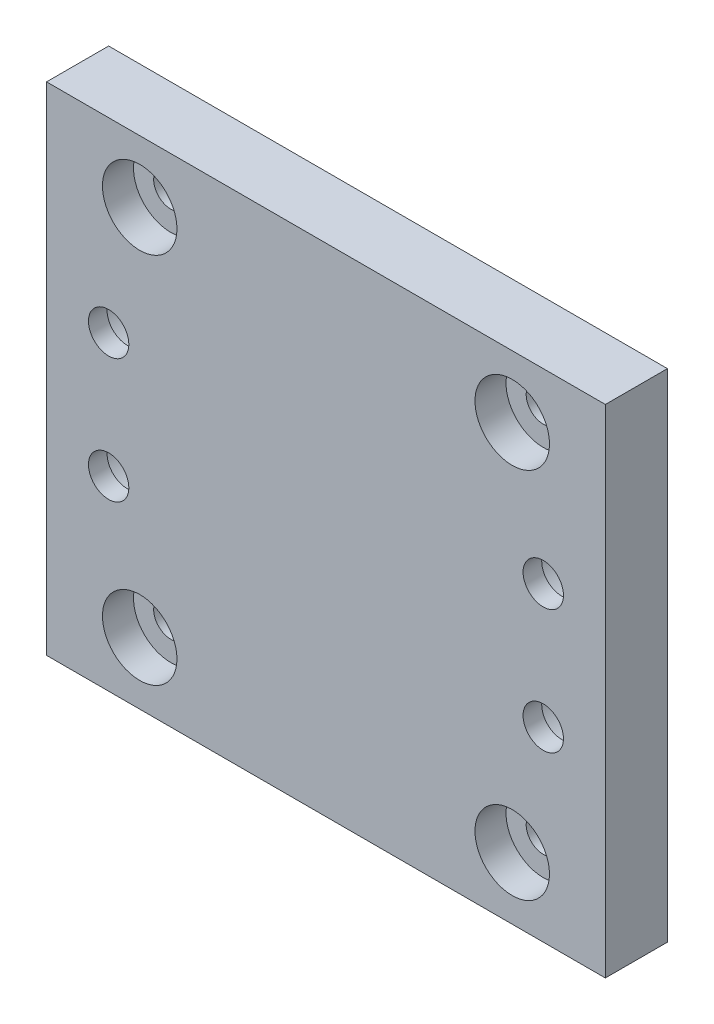
ISO-10303-21;
HEADER;
FILE_DESCRIPTION(('STEP AP214'),'2;1');
FILE_NAME('part.step','',(''),(''),'','','');
FILE_SCHEMA(('AUTOMOTIVE_DESIGN { 1 0 10303 214 1 1 1 1 }'));
ENDSEC;
DATA;
#1=APPLICATION_CONTEXT('core data for automotive mechanical design processes');
#2=APPLICATION_PROTOCOL_DEFINITION('international standard','automotive_design',2000,#1);
#3=PRODUCT_CONTEXT('',#1,'mechanical');
#4=PRODUCT('Part','Part','',(#3));
#5=PRODUCT_RELATED_PRODUCT_CATEGORY('part','',(#4));
#6=PRODUCT_DEFINITION_FORMATION('','',#4);
#7=PRODUCT_DEFINITION_CONTEXT('part definition',#1,'design');
#8=PRODUCT_DEFINITION('design','',#6,#7);
#9=PRODUCT_DEFINITION_SHAPE('','',#8);
#10=(LENGTH_UNIT() NAMED_UNIT(*) SI_UNIT(.MILLI.,.METRE.));
#11=(NAMED_UNIT(*) PLANE_ANGLE_UNIT() SI_UNIT($,.RADIAN.));
#12=(NAMED_UNIT(*) SI_UNIT($,.STERADIAN.) SOLID_ANGLE_UNIT());
#13=UNCERTAINTY_MEASURE_WITH_UNIT(LENGTH_MEASURE(1.E-05),#10,'distance_accuracy_value','');
#14=(GEOMETRIC_REPRESENTATION_CONTEXT(3) GLOBAL_UNCERTAINTY_ASSIGNED_CONTEXT((#13)) GLOBAL_UNIT_ASSIGNED_CONTEXT((#10,
#11,#12)) REPRESENTATION_CONTEXT('',''));
#15=CARTESIAN_POINT('',(0.,0.,0.));
#16=DIRECTION('',(0.,0.,1.));
#17=DIRECTION('',(1.,0.,0.));
#18=AXIS2_PLACEMENT_3D('',#15,#16,#17);
#19=CARTESIAN_POINT('',(-37.4327992920553,16.7884039944123,10.));
#20=DIRECTION('',(0.,0.,-1.));
#21=DIRECTION('',(-1.,0.,0.));
#22=AXIS2_PLACEMENT_3D('',#19,#20,#21);
#23=CYLINDRICAL_SURFACE('',#22,3.25);
#24=CARTESIAN_POINT('',(-37.4327992920553,16.7884039944123,10.));
#25=DIRECTION('',(0.,0.,1.));
#26=DIRECTION('',(1.,0.,0.));
#27=AXIS2_PLACEMENT_3D('',#24,#25,#26);
#28=CIRCLE('',#27,3.25);
#29=CARTESIAN_POINT('',(-34.1827992920553,16.7884039944123,10.));
#30=VERTEX_POINT('',#29);
#31=EDGE_CURVE('E196',#30,#30,#28,.T.);
#32=ORIENTED_EDGE('',*,*,#31,.T.);
#33=EDGE_LOOP('',(#32));
#34=FACE_BOUND('',#33,.T.);
#35=CARTESIAN_POINT('',(-37.4327992920553,16.7884039944123,7.));
#36=DIRECTION('',(0.,0.,-1.));
#37=DIRECTION('',(-1.,0.,0.));
#38=AXIS2_PLACEMENT_3D('',#35,#36,#37);
#39=CIRCLE('',#38,3.25);
#40=CARTESIAN_POINT('',(-40.6827992920553,16.7884039944123,7.));
#41=VERTEX_POINT('',#40);
#42=EDGE_CURVE('E45',#41,#41,#39,.T.);
#43=ORIENTED_EDGE('',*,*,#42,.T.);
#44=EDGE_LOOP('',(#43));
#45=FACE_BOUND('',#44,.T.);
#46=ADVANCED_FACE('F41',(#34,#45),#23,.F.);
#47=CARTESIAN_POINT('',(-37.4327992920553,-3.2115960055877,10.));
#48=DIRECTION('',(0.,0.,-1.));
#49=DIRECTION('',(-1.,0.,0.));
#50=AXIS2_PLACEMENT_3D('',#47,#48,#49);
#51=CYLINDRICAL_SURFACE('',#50,3.25);
#52=CARTESIAN_POINT('',(-37.4327992920553,-3.2115960055877,10.));
#53=DIRECTION('',(0.,0.,1.));
#54=DIRECTION('',(1.,0.,0.));
#55=AXIS2_PLACEMENT_3D('',#52,#53,#54);
#56=CIRCLE('',#55,3.25);
#57=CARTESIAN_POINT('',(-34.1827992920553,-3.2115960055877,10.));
#58=VERTEX_POINT('',#57);
#59=EDGE_CURVE('E192',#58,#58,#56,.T.);
#60=ORIENTED_EDGE('',*,*,#59,.T.);
#61=EDGE_LOOP('',(#60));
#62=FACE_BOUND('',#61,.T.);
#63=CARTESIAN_POINT('',(-37.4327992920553,-3.2115960055877,7.));
#64=DIRECTION('',(0.,0.,-1.));
#65=DIRECTION('',(-1.,0.,0.));
#66=AXIS2_PLACEMENT_3D('',#63,#64,#65);
#67=CIRCLE('',#66,3.25);
#68=CARTESIAN_POINT('',(-40.6827992920553,-3.2115960055877,7.));
#69=VERTEX_POINT('',#68);
#70=EDGE_CURVE('E155',#69,#69,#67,.T.);
#71=ORIENTED_EDGE('',*,*,#70,.T.);
#72=EDGE_LOOP('',(#71));
#73=FACE_BOUND('',#72,.T.);
#74=ADVANCED_FACE('F313',(#62,#73),#51,.F.);
#75=CARTESIAN_POINT('',(32.5672007079447,16.7884039944123,10.));
#76=DIRECTION('',(0.,0.,-1.));
#77=DIRECTION('',(-1.,0.,0.));
#78=AXIS2_PLACEMENT_3D('',#75,#76,#77);
#79=CYLINDRICAL_SURFACE('',#78,3.25);
#80=CARTESIAN_POINT('',(32.5672007079447,16.7884039944123,10.));
#81=DIRECTION('',(0.,0.,1.));
#82=DIRECTION('',(1.,0.,0.));
#83=AXIS2_PLACEMENT_3D('',#80,#81,#82);
#84=CIRCLE('',#83,3.25);
#85=CARTESIAN_POINT('',(35.8172007079447,16.7884039944123,10.));
#86=VERTEX_POINT('',#85);
#87=EDGE_CURVE('E188',#86,#86,#84,.T.);
#88=ORIENTED_EDGE('',*,*,#87,.T.);
#89=EDGE_LOOP('',(#88));
#90=FACE_BOUND('',#89,.T.);
#91=CARTESIAN_POINT('',(32.5672007079447,16.7884039944123,7.));
#92=DIRECTION('',(0.,0.,-1.));
#93=DIRECTION('',(-1.,0.,0.));
#94=AXIS2_PLACEMENT_3D('',#91,#92,#93);
#95=CIRCLE('',#94,3.25);
#96=CARTESIAN_POINT('',(29.3172007079447,16.7884039944123,7.));
#97=VERTEX_POINT('',#96);
#98=EDGE_CURVE('E151',#97,#97,#95,.T.);
#99=ORIENTED_EDGE('',*,*,#98,.T.);
#100=EDGE_LOOP('',(#99));
#101=FACE_BOUND('',#100,.T.);
#102=ADVANCED_FACE('F319',(#90,#101),#79,.F.);
#103=CARTESIAN_POINT('',(32.5672007079447,-3.2115960055877,10.));
#104=DIRECTION('',(0.,0.,-1.));
#105=DIRECTION('',(-1.,0.,0.));
#106=AXIS2_PLACEMENT_3D('',#103,#104,#105);
#107=CYLINDRICAL_SURFACE('',#106,3.25);
#108=CARTESIAN_POINT('',(32.5672007079447,-3.2115960055877,10.));
#109=DIRECTION('',(0.,0.,1.));
#110=DIRECTION('',(1.,0.,0.));
#111=AXIS2_PLACEMENT_3D('',#108,#109,#110);
#112=CIRCLE('',#111,3.25);
#113=CARTESIAN_POINT('',(35.8172007079447,-3.2115960055877,10.));
#114=VERTEX_POINT('',#113);
#115=EDGE_CURVE('E146',#114,#114,#112,.T.);
#116=ORIENTED_EDGE('',*,*,#115,.T.);
#117=EDGE_LOOP('',(#116));
#118=FACE_BOUND('',#117,.T.);
#119=CARTESIAN_POINT('',(32.5672007079447,-3.2115960055877,7.));
#120=DIRECTION('',(0.,0.,-1.));
#121=DIRECTION('',(-1.,0.,0.));
#122=AXIS2_PLACEMENT_3D('',#119,#120,#121);
#123=CIRCLE('',#122,3.25);
#124=CARTESIAN_POINT('',(29.3172007079447,-3.2115960055877,7.));
#125=VERTEX_POINT('',#124);
#126=EDGE_CURVE('E147',#125,#125,#123,.T.);
#127=ORIENTED_EDGE('',*,*,#126,.T.);
#128=EDGE_LOOP('',(#127));
#129=FACE_BOUND('',#128,.T.);
#130=ADVANCED_FACE('F334',(#118,#129),#107,.F.);
#131=CARTESIAN_POINT('',(-32.4327992920553,36.7884039944123,10.));
#132=DIRECTION('',(0.,0.,-1.));
#133=DIRECTION('',(-1.,0.,0.));
#134=AXIS2_PLACEMENT_3D('',#131,#132,#133);
#135=CYLINDRICAL_SURFACE('',#134,2.75);
#136=CARTESIAN_POINT('',(-32.4327992920553,36.7884039944123,0.));
#137=DIRECTION('',(0.,0.,1.));
#138=DIRECTION('',(1.,0.,0.));
#139=AXIS2_PLACEMENT_3D('',#136,#137,#138);
#140=CIRCLE('',#139,2.75);
#141=CARTESIAN_POINT('',(-29.6827992920553,36.7884039944123,0.));
#142=VERTEX_POINT('',#141);
#143=EDGE_CURVE('E118',#142,#142,#140,.T.);
#144=ORIENTED_EDGE('',*,*,#143,.F.);
#145=EDGE_LOOP('',(#144));
#146=FACE_BOUND('',#145,.T.);
#147=CARTESIAN_POINT('',(-32.4327992920553,36.7884039944123,5.));
#148=DIRECTION('',(0.,0.,1.));
#149=DIRECTION('',(1.,0.,0.));
#150=AXIS2_PLACEMENT_3D('',#147,#148,#149);
#151=CIRCLE('',#150,2.75);
#152=CARTESIAN_POINT('',(-29.6827992920553,36.7884039944123,5.));
#153=VERTEX_POINT('',#152);
#154=EDGE_CURVE('E142',#153,#153,#151,.T.);
#155=ORIENTED_EDGE('',*,*,#154,.T.);
#156=EDGE_LOOP('',(#155));
#157=FACE_BOUND('',#156,.T.);
#158=ADVANCED_FACE('F330',(#146,#157),#135,.F.);
#159=CARTESIAN_POINT('',(27.5672007079447,36.7884039944123,10.));
#160=DIRECTION('',(0.,0.,-1.));
#161=DIRECTION('',(-1.,0.,0.));
#162=AXIS2_PLACEMENT_3D('',#159,#160,#161);
#163=CYLINDRICAL_SURFACE('',#162,2.75);
#164=CARTESIAN_POINT('',(27.5672007079447,36.7884039944123,0.));
#165=DIRECTION('',(0.,0.,1.));
#166=DIRECTION('',(1.,0.,0.));
#167=AXIS2_PLACEMENT_3D('',#164,#165,#166);
#168=CIRCLE('',#167,2.75);
#169=CARTESIAN_POINT('',(30.3172007079447,36.7884039944123,0.));
#170=VERTEX_POINT('',#169);
#171=EDGE_CURVE('E208',#170,#170,#168,.T.);
#172=ORIENTED_EDGE('',*,*,#171,.F.);
#173=EDGE_LOOP('',(#172));
#174=FACE_BOUND('',#173,.T.);
#175=CARTESIAN_POINT('',(27.5672007079447,36.7884039944123,5.));
#176=DIRECTION('',(0.,0.,1.));
#177=DIRECTION('',(1.,0.,0.));
#178=AXIS2_PLACEMENT_3D('',#175,#176,#177);
#179=CIRCLE('',#178,2.75);
#180=CARTESIAN_POINT('',(30.3172007079447,36.7884039944123,5.));
#181=VERTEX_POINT('',#180);
#182=EDGE_CURVE('E138',#181,#181,#179,.T.);
#183=ORIENTED_EDGE('',*,*,#182,.T.);
#184=EDGE_LOOP('',(#183));
#185=FACE_BOUND('',#184,.T.);
#186=ADVANCED_FACE('F326',(#174,#185),#163,.F.);
#187=CARTESIAN_POINT('',(27.5672007079447,-23.2115960055877,10.));
#188=DIRECTION('',(0.,0.,-1.));
#189=DIRECTION('',(-1.,0.,0.));
#190=AXIS2_PLACEMENT_3D('',#187,#188,#189);
#191=CYLINDRICAL_SURFACE('',#190,2.75);
#192=CARTESIAN_POINT('',(27.5672007079447,-23.2115960055877,0.));
#193=DIRECTION('',(0.,0.,1.));
#194=DIRECTION('',(1.,0.,0.));
#195=AXIS2_PLACEMENT_3D('',#192,#193,#194);
#196=CIRCLE('',#195,2.75);
#197=CARTESIAN_POINT('',(30.3172007079447,-23.2115960055877,0.));
#198=VERTEX_POINT('',#197);
#199=EDGE_CURVE('E204',#198,#198,#196,.T.);
#200=ORIENTED_EDGE('',*,*,#199,.F.);
#201=EDGE_LOOP('',(#200));
#202=FACE_BOUND('',#201,.T.);
#203=CARTESIAN_POINT('',(27.5672007079447,-23.2115960055877,5.));
#204=DIRECTION('',(0.,0.,1.));
#205=DIRECTION('',(1.,0.,0.));
#206=AXIS2_PLACEMENT_3D('',#203,#204,#205);
#207=CIRCLE('',#206,2.75);
#208=CARTESIAN_POINT('',(30.3172007079447,-23.2115960055877,5.));
#209=VERTEX_POINT('',#208);
#210=EDGE_CURVE('E133',#209,#209,#207,.T.);
#211=ORIENTED_EDGE('',*,*,#210,.T.);
#212=EDGE_LOOP('',(#211));
#213=FACE_BOUND('',#212,.T.);
#214=ADVANCED_FACE('F292',(#202,#213),#191,.F.);
#215=CARTESIAN_POINT('',(-32.4327992920553,-23.2115960055877,10.));
#216=DIRECTION('',(0.,0.,-1.));
#217=DIRECTION('',(-1.,0.,0.));
#218=AXIS2_PLACEMENT_3D('',#215,#216,#217);
#219=CYLINDRICAL_SURFACE('',#218,2.74999999999999);
#220=CARTESIAN_POINT('',(-32.4327992920553,-23.2115960055877,0.));
#221=DIRECTION('',(0.,0.,1.));
#222=DIRECTION('',(1.,0.,0.));
#223=AXIS2_PLACEMENT_3D('',#220,#221,#222);
#224=CIRCLE('',#223,2.74999999999999);
#225=CARTESIAN_POINT('',(-29.6827992920553,-23.2115960055877,0.));
#226=VERTEX_POINT('',#225);
#227=EDGE_CURVE('E200',#226,#226,#224,.T.);
#228=ORIENTED_EDGE('',*,*,#227,.F.);
#229=EDGE_LOOP('',(#228));
#230=FACE_BOUND('',#229,.T.);
#231=CARTESIAN_POINT('',(-32.4327992920553,-23.2115960055877,5.));
#232=DIRECTION('',(0.,0.,1.));
#233=DIRECTION('',(1.,0.,0.));
#234=AXIS2_PLACEMENT_3D('',#231,#232,#233);
#235=CIRCLE('',#234,2.74999999999999);
#236=CARTESIAN_POINT('',(-29.6827992920553,-23.2115960055877,5.));
#237=VERTEX_POINT('',#236);
#238=EDGE_CURVE('E129',#237,#237,#235,.T.);
#239=ORIENTED_EDGE('',*,*,#238,.T.);
#240=EDGE_LOOP('',(#239));
#241=FACE_BOUND('',#240,.T.);
#242=ADVANCED_FACE('F289',(#230,#241),#219,.F.);
#243=CARTESIAN_POINT('',(0.,0.,10.));
#244=DIRECTION('',(0.,0.,1.));
#245=DIRECTION('',(1.,0.,0.));
#246=AXIS2_PLACEMENT_3D('',#243,#244,#245);
#247=PLANE('',#246);
#248=CARTESIAN_POINT('',(-32.4327992920553,-23.2115960055877,10.));
#249=DIRECTION('',(0.,0.,1.));
#250=DIRECTION('',(1.,0.,0.));
#251=AXIS2_PLACEMENT_3D('',#248,#249,#250);
#252=CIRCLE('',#251,6.);
#253=CARTESIAN_POINT('',(-26.4327992920553,-23.2115960055877,10.));
#254=VERTEX_POINT('',#253);
#255=EDGE_CURVE('E162',#254,#254,#252,.T.);
#256=ORIENTED_EDGE('',*,*,#255,.F.);
#257=EDGE_LOOP('',(#256));
#258=FACE_BOUND('',#257,.T.);
#259=CARTESIAN_POINT('',(27.5672007079447,-23.2115960055877,10.));
#260=DIRECTION('',(0.,0.,1.));
#261=DIRECTION('',(1.,0.,0.));
#262=AXIS2_PLACEMENT_3D('',#259,#260,#261);
#263=CIRCLE('',#262,6.);
#264=CARTESIAN_POINT('',(33.5672007079447,-23.2115960055877,10.));
#265=VERTEX_POINT('',#264);
#266=EDGE_CURVE('E173',#265,#265,#263,.T.);
#267=ORIENTED_EDGE('',*,*,#266,.F.);
#268=EDGE_LOOP('',(#267));
#269=FACE_BOUND('',#268,.T.);
#270=CARTESIAN_POINT('',(27.5672007079447,36.7884039944123,10.));
#271=DIRECTION('',(0.,0.,1.));
#272=DIRECTION('',(1.,0.,0.));
#273=AXIS2_PLACEMENT_3D('',#270,#271,#272);
#274=CIRCLE('',#273,6.);
#275=CARTESIAN_POINT('',(33.5672007079447,36.7884039944123,10.));
#276=VERTEX_POINT('',#275);
#277=EDGE_CURVE('E218',#276,#276,#274,.T.);
#278=ORIENTED_EDGE('',*,*,#277,.F.);
#279=EDGE_LOOP('',(#278));
#280=FACE_BOUND('',#279,.T.);
#281=CARTESIAN_POINT('',(-32.4327992920553,36.7884039944123,10.));
#282=DIRECTION('',(0.,0.,1.));
#283=DIRECTION('',(1.,0.,0.));
#284=AXIS2_PLACEMENT_3D('',#281,#282,#283);
#285=CIRCLE('',#284,6.);
#286=CARTESIAN_POINT('',(-26.4327992920553,36.7884039944123,10.));
#287=VERTEX_POINT('',#286);
#288=EDGE_CURVE('E180',#287,#287,#285,.T.);
#289=ORIENTED_EDGE('',*,*,#288,.F.);
#290=EDGE_LOOP('',(#289));
#291=FACE_BOUND('',#290,.T.);
#292=ORIENTED_EDGE('',*,*,#87,.F.);
#293=EDGE_LOOP('',(#292));
#294=FACE_BOUND('',#293,.T.);
#295=ORIENTED_EDGE('',*,*,#31,.F.);
#296=EDGE_LOOP('',(#295));
#297=FACE_BOUND('',#296,.T.);
#298=DIRECTION('',(0.,-1.,0.));
#299=VECTOR('',#298,1.);
#300=CARTESIAN_POINT('',(-47.4327992920553,46.7884039944123,10.));
#301=LINE('',#300,#299);
#302=CARTESIAN_POINT('',(-47.4327992920553,46.7884039944123,10.));
#303=VERTEX_POINT('',#302);
#304=CARTESIAN_POINT('',(-47.4327992920553,-33.2115960055877,10.));
#305=VERTEX_POINT('',#304);
#306=EDGE_CURVE('E97',#303,#305,#301,.T.);
#307=ORIENTED_EDGE('',*,*,#306,.T.);
#308=DIRECTION('',(1.,0.,0.));
#309=VECTOR('',#308,1.);
#310=CARTESIAN_POINT('',(-47.4327992920553,-33.2115960055877,10.));
#311=LINE('',#310,#309);
#312=CARTESIAN_POINT('',(42.5672007079447,-33.2115960055877,10.));
#313=VERTEX_POINT('',#312);
#314=EDGE_CURVE('E91',#305,#313,#311,.T.);
#315=ORIENTED_EDGE('',*,*,#314,.T.);
#316=DIRECTION('',(0.,1.,0.));
#317=VECTOR('',#316,1.);
#318=CARTESIAN_POINT('',(42.5672007079447,46.7884039944123,10.));
#319=LINE('',#318,#317);
#320=CARTESIAN_POINT('',(42.5672007079447,46.7884039944123,10.));
#321=VERTEX_POINT('',#320);
#322=EDGE_CURVE('E95',#313,#321,#319,.T.);
#323=ORIENTED_EDGE('',*,*,#322,.T.);
#324=DIRECTION('',(-1.,0.,0.));
#325=VECTOR('',#324,1.);
#326=CARTESIAN_POINT('',(-47.4327992920553,46.7884039944123,10.));
#327=LINE('',#326,#325);
#328=EDGE_CURVE('E61',#321,#303,#327,.T.);
#329=ORIENTED_EDGE('',*,*,#328,.T.);
#330=EDGE_LOOP('',(#307,#315,#323,#329));
#331=FACE_BOUND('',#330,.T.);
#332=ORIENTED_EDGE('',*,*,#59,.F.);
#333=EDGE_LOOP('',(#332));
#334=FACE_BOUND('',#333,.T.);
#335=ORIENTED_EDGE('',*,*,#115,.F.);
#336=EDGE_LOOP('',(#335));
#337=FACE_BOUND('',#336,.T.);
#338=ADVANCED_FACE('F92',(#258,#269,#280,#291,#294,#297,#331,#334,#337),#247,.T.);
#339=CARTESIAN_POINT('',(0.,0.,0.));
#340=DIRECTION('',(0.,0.,1.));
#341=DIRECTION('',(1.,0.,0.));
#342=AXIS2_PLACEMENT_3D('',#339,#340,#341);
#343=PLANE('',#342);
#344=CARTESIAN_POINT('',(32.5672007079447,-3.2115960055877,0.));
#345=DIRECTION('',(0.,0.,-1.));
#346=DIRECTION('',(-1.,0.,0.));
#347=AXIS2_PLACEMENT_3D('',#344,#345,#346);
#348=CIRCLE('',#347,7.);
#349=CARTESIAN_POINT('',(25.5672007079447,-3.2115960055877,0.));
#350=VERTEX_POINT('',#349);
#351=EDGE_CURVE('E239',#350,#350,#348,.T.);
#352=ORIENTED_EDGE('',*,*,#351,.F.);
#353=EDGE_LOOP('',(#352));
#354=FACE_BOUND('',#353,.T.);
#355=CARTESIAN_POINT('',(-37.4327992920553,-3.2115960055877,0.));
#356=DIRECTION('',(0.,0.,-1.));
#357=DIRECTION('',(-1.,0.,0.));
#358=AXIS2_PLACEMENT_3D('',#355,#356,#357);
#359=CIRCLE('',#358,7.);
#360=CARTESIAN_POINT('',(-44.4327992920553,-3.2115960055877,0.));
#361=VERTEX_POINT('',#360);
#362=EDGE_CURVE('E247',#361,#361,#359,.T.);
#363=ORIENTED_EDGE('',*,*,#362,.F.);
#364=EDGE_LOOP('',(#363));
#365=FACE_BOUND('',#364,.T.);
#366=CARTESIAN_POINT('',(-37.4327992920553,16.7884039944123,0.));
#367=DIRECTION('',(0.,0.,-1.));
#368=DIRECTION('',(-1.,0.,0.));
#369=AXIS2_PLACEMENT_3D('',#366,#367,#368);
#370=CIRCLE('',#369,7.);
#371=CARTESIAN_POINT('',(-44.4327992920553,16.7884039944123,0.));
#372=VERTEX_POINT('',#371);
#373=EDGE_CURVE('E255',#372,#372,#370,.T.);
#374=ORIENTED_EDGE('',*,*,#373,.F.);
#375=EDGE_LOOP('',(#374));
#376=FACE_BOUND('',#375,.T.);
#377=CARTESIAN_POINT('',(32.5672007079447,16.7884039944123,0.));
#378=DIRECTION('',(0.,0.,-1.));
#379=DIRECTION('',(-1.,0.,0.));
#380=AXIS2_PLACEMENT_3D('',#377,#378,#379);
#381=CIRCLE('',#380,7.);
#382=CARTESIAN_POINT('',(25.5672007079447,16.7884039944123,0.));
#383=VERTEX_POINT('',#382);
#384=EDGE_CURVE('E231',#383,#383,#381,.T.);
#385=ORIENTED_EDGE('',*,*,#384,.F.);
#386=EDGE_LOOP('',(#385));
#387=FACE_BOUND('',#386,.T.);
#388=DIRECTION('',(0.,-1.,0.));
#389=VECTOR('',#388,1.);
#390=CARTESIAN_POINT('',(-47.4327992920553,46.7884039944123,0.));
#391=LINE('',#390,#389);
#392=CARTESIAN_POINT('',(-47.4327992920553,46.7884039944123,0.));
#393=VERTEX_POINT('',#392);
#394=CARTESIAN_POINT('',(-47.4327992920553,-33.2115960055877,0.));
#395=VERTEX_POINT('',#394);
#396=EDGE_CURVE('E114',#393,#395,#391,.T.);
#397=ORIENTED_EDGE('',*,*,#396,.F.);
#398=DIRECTION('',(-1.,0.,0.));
#399=VECTOR('',#398,1.);
#400=CARTESIAN_POINT('',(-47.4327992920553,46.7884039944123,0.));
#401=LINE('',#400,#399);
#402=CARTESIAN_POINT('',(42.5672007079447,46.7884039944123,0.));
#403=VERTEX_POINT('',#402);
#404=EDGE_CURVE('E84',#403,#393,#401,.T.);
#405=ORIENTED_EDGE('',*,*,#404,.F.);
#406=DIRECTION('',(0.,1.,0.));
#407=VECTOR('',#406,1.);
#408=CARTESIAN_POINT('',(42.5672007079447,46.7884039944123,0.));
#409=LINE('',#408,#407);
#410=CARTESIAN_POINT('',(42.5672007079447,-33.2115960055877,0.));
#411=VERTEX_POINT('',#410);
#412=EDGE_CURVE('E78',#411,#403,#409,.T.);
#413=ORIENTED_EDGE('',*,*,#412,.F.);
#414=DIRECTION('',(1.,0.,0.));
#415=VECTOR('',#414,1.);
#416=CARTESIAN_POINT('',(-47.4327992920553,-33.2115960055877,0.));
#417=LINE('',#416,#415);
#418=EDGE_CURVE('E102',#395,#411,#417,.T.);
#419=ORIENTED_EDGE('',*,*,#418,.F.);
#420=EDGE_LOOP('',(#397,#405,#413,#419));
#421=FACE_BOUND('',#420,.T.);
#422=ORIENTED_EDGE('',*,*,#143,.T.);
#423=EDGE_LOOP('',(#422));
#424=FACE_BOUND('',#423,.T.);
#425=ORIENTED_EDGE('',*,*,#171,.T.);
#426=EDGE_LOOP('',(#425));
#427=FACE_BOUND('',#426,.T.);
#428=ORIENTED_EDGE('',*,*,#199,.T.);
#429=EDGE_LOOP('',(#428));
#430=FACE_BOUND('',#429,.T.);
#431=ORIENTED_EDGE('',*,*,#227,.T.);
#432=EDGE_LOOP('',(#431));
#433=FACE_BOUND('',#432,.T.);
#434=ADVANCED_FACE('F272',(#354,#365,#376,#387,#421,#424,#427,#430,#433),#343,.F.);
#435=CARTESIAN_POINT('',(-47.4327992920553,46.7884039944123,10.));
#436=DIRECTION('',(1.,0.,0.));
#437=DIRECTION('',(0.,0.,-1.));
#438=AXIS2_PLACEMENT_3D('',#435,#436,#437);
#439=PLANE('',#438);
#440=ORIENTED_EDGE('',*,*,#396,.T.);
#441=DIRECTION('',(0.,0.,-1.));
#442=VECTOR('',#441,1.);
#443=CARTESIAN_POINT('',(-47.4327992920553,-33.2115960055877,10.));
#444=LINE('',#443,#442);
#445=EDGE_CURVE('E11',#305,#395,#444,.T.);
#446=ORIENTED_EDGE('',*,*,#445,.F.);
#447=ORIENTED_EDGE('',*,*,#306,.F.);
#448=DIRECTION('',(0.,0.,-1.));
#449=VECTOR('',#448,1.);
#450=CARTESIAN_POINT('',(-47.4327992920553,46.7884039944123,10.));
#451=LINE('',#450,#449);
#452=EDGE_CURVE('E110',#303,#393,#451,.T.);
#453=ORIENTED_EDGE('',*,*,#452,.T.);
#454=EDGE_LOOP('',(#440,#446,#447,#453));
#455=FACE_BOUND('',#454,.T.);
#456=ADVANCED_FACE('F43',(#455),#439,.F.);
#457=CARTESIAN_POINT('',(-47.4327992920553,-33.2115960055877,10.));
#458=DIRECTION('',(0.,1.,0.));
#459=DIRECTION('',(0.,0.,1.));
#460=AXIS2_PLACEMENT_3D('',#457,#458,#459);
#461=PLANE('',#460);
#462=ORIENTED_EDGE('',*,*,#418,.T.);
#463=DIRECTION('',(0.,0.,-1.));
#464=VECTOR('',#463,1.);
#465=CARTESIAN_POINT('',(42.5672007079447,-33.2115960055877,10.));
#466=LINE('',#465,#464);
#467=EDGE_CURVE('E52',#313,#411,#466,.T.);
#468=ORIENTED_EDGE('',*,*,#467,.F.);
#469=ORIENTED_EDGE('',*,*,#314,.F.);
#470=ORIENTED_EDGE('',*,*,#445,.T.);
#471=EDGE_LOOP('',(#462,#468,#469,#470));
#472=FACE_BOUND('',#471,.T.);
#473=ADVANCED_FACE('F101',(#472),#461,.F.);
#474=CARTESIAN_POINT('',(42.5672007079447,46.7884039944123,10.));
#475=DIRECTION('',(-1.,0.,0.));
#476=DIRECTION('',(0.,-1.,0.));
#477=AXIS2_PLACEMENT_3D('',#474,#475,#476);
#478=PLANE('',#477);
#479=ORIENTED_EDGE('',*,*,#412,.T.);
#480=DIRECTION('',(0.,0.,-1.));
#481=VECTOR('',#480,1.);
#482=CARTESIAN_POINT('',(42.5672007079447,46.7884039944123,10.));
#483=LINE('',#482,#481);
#484=EDGE_CURVE('E104',#321,#403,#483,.T.);
#485=ORIENTED_EDGE('',*,*,#484,.F.);
#486=ORIENTED_EDGE('',*,*,#322,.F.);
#487=ORIENTED_EDGE('',*,*,#467,.T.);
#488=EDGE_LOOP('',(#479,#485,#486,#487));
#489=FACE_BOUND('',#488,.T.);
#490=ADVANCED_FACE('F106',(#489),#478,.F.);
#491=CARTESIAN_POINT('',(-47.4327992920553,46.7884039944123,10.));
#492=DIRECTION('',(0.,-1.,0.));
#493=DIRECTION('',(0.,0.,-1.));
#494=AXIS2_PLACEMENT_3D('',#491,#492,#493);
#495=PLANE('',#494);
#496=ORIENTED_EDGE('',*,*,#404,.T.);
#497=ORIENTED_EDGE('',*,*,#452,.F.);
#498=ORIENTED_EDGE('',*,*,#328,.F.);
#499=ORIENTED_EDGE('',*,*,#484,.T.);
#500=EDGE_LOOP('',(#496,#497,#498,#499));
#501=FACE_BOUND('',#500,.T.);
#502=ADVANCED_FACE('F305',(#501),#495,.F.);
#503=CARTESIAN_POINT('',(-32.4327992920553,-23.2115960055877,5.));
#504=DIRECTION('',(0.,0.,1.));
#505=DIRECTION('',(1.,0.,0.));
#506=AXIS2_PLACEMENT_3D('',#503,#504,#505);
#507=CYLINDRICAL_SURFACE('',#506,6.);
#508=CARTESIAN_POINT('',(-32.4327992920553,-23.2115960055877,5.));
#509=DIRECTION('',(0.,0.,1.));
#510=DIRECTION('',(1.,0.,0.));
#511=AXIS2_PLACEMENT_3D('',#508,#509,#510);
#512=CIRCLE('',#511,6.);
#513=CARTESIAN_POINT('',(-26.4327992920553,-23.2115960055877,5.));
#514=VERTEX_POINT('',#513);
#515=EDGE_CURVE('E167',#514,#514,#512,.T.);
#516=ORIENTED_EDGE('',*,*,#515,.F.);
#517=EDGE_LOOP('',(#516));
#518=FACE_BOUND('',#517,.T.);
#519=ORIENTED_EDGE('',*,*,#255,.T.);
#520=EDGE_LOOP('',(#519));
#521=FACE_BOUND('',#520,.T.);
#522=ADVANCED_FACE('F300',(#518,#521),#507,.F.);
#523=CARTESIAN_POINT('',(-32.4327992920553,-23.2115960055877,5.));
#524=DIRECTION('',(0.,0.,1.));
#525=DIRECTION('',(1.,0.,0.));
#526=AXIS2_PLACEMENT_3D('',#523,#524,#525);
#527=PLANE('',#526);
#528=ORIENTED_EDGE('',*,*,#238,.F.);
#529=EDGE_LOOP('',(#528));
#530=FACE_BOUND('',#529,.T.);
#531=ORIENTED_EDGE('',*,*,#515,.T.);
#532=EDGE_LOOP('',(#531));
#533=FACE_BOUND('',#532,.T.);
#534=ADVANCED_FACE('F296',(#530,#533),#527,.T.);
#535=CARTESIAN_POINT('',(27.5672007079447,-23.2115960055877,5.));
#536=DIRECTION('',(0.,0.,1.));
#537=DIRECTION('',(1.,0.,0.));
#538=AXIS2_PLACEMENT_3D('',#535,#536,#537);
#539=CYLINDRICAL_SURFACE('',#538,6.);
#540=CARTESIAN_POINT('',(27.5672007079447,-23.2115960055877,5.));
#541=DIRECTION('',(0.,0.,1.));
#542=DIRECTION('',(1.,0.,0.));
#543=AXIS2_PLACEMENT_3D('',#540,#541,#542);
#544=CIRCLE('',#543,6.);
#545=CARTESIAN_POINT('',(33.5672007079447,-23.2115960055877,5.));
#546=VERTEX_POINT('',#545);
#547=EDGE_CURVE('E222',#546,#546,#544,.T.);
#548=ORIENTED_EDGE('',*,*,#547,.F.);
#549=EDGE_LOOP('',(#548));
#550=FACE_BOUND('',#549,.T.);
#551=ORIENTED_EDGE('',*,*,#266,.T.);
#552=EDGE_LOOP('',(#551));
#553=FACE_BOUND('',#552,.T.);
#554=ADVANCED_FACE('F299',(#550,#553),#539,.F.);
#555=CARTESIAN_POINT('',(27.5672007079447,-23.2115960055877,5.));
#556=DIRECTION('',(0.,0.,1.));
#557=DIRECTION('',(1.,0.,0.));
#558=AXIS2_PLACEMENT_3D('',#555,#556,#557);
#559=PLANE('',#558);
#560=ORIENTED_EDGE('',*,*,#210,.F.);
#561=EDGE_LOOP('',(#560));
#562=FACE_BOUND('',#561,.T.);
#563=ORIENTED_EDGE('',*,*,#547,.T.);
#564=EDGE_LOOP('',(#563));
#565=FACE_BOUND('',#564,.T.);
#566=ADVANCED_FACE('F436',(#562,#565),#559,.T.);
#567=CARTESIAN_POINT('',(27.5672007079447,36.7884039944123,5.));
#568=DIRECTION('',(0.,0.,1.));
#569=DIRECTION('',(1.,0.,0.));
#570=AXIS2_PLACEMENT_3D('',#567,#568,#569);
#571=CYLINDRICAL_SURFACE('',#570,6.);
#572=CARTESIAN_POINT('',(27.5672007079447,36.7884039944123,5.));
#573=DIRECTION('',(0.,0.,1.));
#574=DIRECTION('',(1.,0.,0.));
#575=AXIS2_PLACEMENT_3D('',#572,#573,#574);
#576=CIRCLE('',#575,6.);
#577=CARTESIAN_POINT('',(33.5672007079447,36.7884039944123,5.));
#578=VERTEX_POINT('',#577);
#579=EDGE_CURVE('E184',#578,#578,#576,.T.);
#580=ORIENTED_EDGE('',*,*,#579,.F.);
#581=EDGE_LOOP('',(#580));
#582=FACE_BOUND('',#581,.T.);
#583=ORIENTED_EDGE('',*,*,#277,.T.);
#584=EDGE_LOOP('',(#583));
#585=FACE_BOUND('',#584,.T.);
#586=ADVANCED_FACE('F426',(#582,#585),#571,.F.);
#587=CARTESIAN_POINT('',(27.5672007079447,36.7884039944123,5.));
#588=DIRECTION('',(0.,0.,1.));
#589=DIRECTION('',(1.,0.,0.));
#590=AXIS2_PLACEMENT_3D('',#587,#588,#589);
#591=PLANE('',#590);
#592=ORIENTED_EDGE('',*,*,#182,.F.);
#593=EDGE_LOOP('',(#592));
#594=FACE_BOUND('',#593,.T.);
#595=ORIENTED_EDGE('',*,*,#579,.T.);
#596=EDGE_LOOP('',(#595));
#597=FACE_BOUND('',#596,.T.);
#598=ADVANCED_FACE('F416',(#594,#597),#591,.T.);
#599=CARTESIAN_POINT('',(-32.4327992920553,36.7884039944123,5.));
#600=DIRECTION('',(0.,0.,1.));
#601=DIRECTION('',(1.,0.,0.));
#602=AXIS2_PLACEMENT_3D('',#599,#600,#601);
#603=CYLINDRICAL_SURFACE('',#602,6.);
#604=CARTESIAN_POINT('',(-32.4327992920553,36.7884039944123,5.));
#605=DIRECTION('',(0.,0.,1.));
#606=DIRECTION('',(1.,0.,0.));
#607=AXIS2_PLACEMENT_3D('',#604,#605,#606);
#608=CIRCLE('',#607,6.);
#609=CARTESIAN_POINT('',(-26.4327992920553,36.7884039944123,5.));
#610=VERTEX_POINT('',#609);
#611=EDGE_CURVE('E134',#610,#610,#608,.T.);
#612=ORIENTED_EDGE('',*,*,#611,.F.);
#613=EDGE_LOOP('',(#612));
#614=FACE_BOUND('',#613,.T.);
#615=ORIENTED_EDGE('',*,*,#288,.T.);
#616=EDGE_LOOP('',(#615));
#617=FACE_BOUND('',#616,.T.);
#618=ADVANCED_FACE('F406',(#614,#617),#603,.F.);
#619=CARTESIAN_POINT('',(-32.4327992920553,36.7884039944123,5.));
#620=DIRECTION('',(0.,0.,1.));
#621=DIRECTION('',(1.,0.,0.));
#622=AXIS2_PLACEMENT_3D('',#619,#620,#621);
#623=PLANE('',#622);
#624=ORIENTED_EDGE('',*,*,#154,.F.);
#625=EDGE_LOOP('',(#624));
#626=FACE_BOUND('',#625,.T.);
#627=ORIENTED_EDGE('',*,*,#611,.T.);
#628=EDGE_LOOP('',(#627));
#629=FACE_BOUND('',#628,.T.);
#630=ADVANCED_FACE('F400',(#626,#629),#623,.T.);
#631=CARTESIAN_POINT('',(32.5672007079447,-3.2115960055877,7.));
#632=DIRECTION('',(0.,0.,-1.));
#633=DIRECTION('',(-1.,0.,0.));
#634=AXIS2_PLACEMENT_3D('',#631,#632,#633);
#635=CYLINDRICAL_SURFACE('',#634,7.);
#636=CARTESIAN_POINT('',(32.5672007079447,-3.2115960055877,7.));
#637=DIRECTION('',(0.,0.,-1.));
#638=DIRECTION('',(-1.,0.,0.));
#639=AXIS2_PLACEMENT_3D('',#636,#637,#638);
#640=CIRCLE('',#639,7.);
#641=CARTESIAN_POINT('',(25.5672007079447,-3.2115960055877,7.));
#642=VERTEX_POINT('',#641);
#643=EDGE_CURVE('E243',#642,#642,#640,.T.);
#644=ORIENTED_EDGE('',*,*,#643,.F.);
#645=EDGE_LOOP('',(#644));
#646=FACE_BOUND('',#645,.T.);
#647=ORIENTED_EDGE('',*,*,#351,.T.);
#648=EDGE_LOOP('',(#647));
#649=FACE_BOUND('',#648,.T.);
#650=ADVANCED_FACE('F405',(#646,#649),#635,.F.);
#651=CARTESIAN_POINT('',(32.5672007079447,-3.2115960055877,7.));
#652=DIRECTION('',(0.,0.,-1.));
#653=DIRECTION('',(-1.,0.,0.));
#654=AXIS2_PLACEMENT_3D('',#651,#652,#653);
#655=PLANE('',#654);
#656=ORIENTED_EDGE('',*,*,#126,.F.);
#657=EDGE_LOOP('',(#656));
#658=FACE_BOUND('',#657,.T.);
#659=ORIENTED_EDGE('',*,*,#643,.T.);
#660=EDGE_LOOP('',(#659));
#661=FACE_BOUND('',#660,.T.);
#662=ADVANCED_FACE('F504',(#658,#661),#655,.T.);
#663=CARTESIAN_POINT('',(32.5672007079447,16.7884039944123,7.));
#664=DIRECTION('',(0.,0.,-1.));
#665=DIRECTION('',(-1.,0.,0.));
#666=AXIS2_PLACEMENT_3D('',#663,#664,#665);
#667=CYLINDRICAL_SURFACE('',#666,7.);
#668=CARTESIAN_POINT('',(32.5672007079447,16.7884039944123,7.));
#669=DIRECTION('',(0.,0.,-1.));
#670=DIRECTION('',(-1.,0.,0.));
#671=AXIS2_PLACEMENT_3D('',#668,#669,#670);
#672=CIRCLE('',#671,7.);
#673=CARTESIAN_POINT('',(25.5672007079447,16.7884039944123,7.));
#674=VERTEX_POINT('',#673);
#675=EDGE_CURVE('E152',#674,#674,#672,.T.);
#676=ORIENTED_EDGE('',*,*,#675,.F.);
#677=EDGE_LOOP('',(#676));
#678=FACE_BOUND('',#677,.T.);
#679=ORIENTED_EDGE('',*,*,#384,.T.);
#680=EDGE_LOOP('',(#679));
#681=FACE_BOUND('',#680,.T.);
#682=ADVANCED_FACE('F500',(#678,#681),#667,.F.);
#683=CARTESIAN_POINT('',(32.5672007079447,16.7884039944123,7.));
#684=DIRECTION('',(0.,0.,-1.));
#685=DIRECTION('',(-1.,0.,0.));
#686=AXIS2_PLACEMENT_3D('',#683,#684,#685);
#687=PLANE('',#686);
#688=ORIENTED_EDGE('',*,*,#98,.F.);
#689=EDGE_LOOP('',(#688));
#690=FACE_BOUND('',#689,.T.);
#691=ORIENTED_EDGE('',*,*,#675,.T.);
#692=EDGE_LOOP('',(#691));
#693=FACE_BOUND('',#692,.T.);
#694=ADVANCED_FACE('F503',(#690,#693),#687,.T.);
#695=CARTESIAN_POINT('',(-37.4327992920553,-3.2115960055877,7.));
#696=DIRECTION('',(0.,0.,-1.));
#697=DIRECTION('',(-1.,0.,0.));
#698=AXIS2_PLACEMENT_3D('',#695,#696,#697);
#699=CYLINDRICAL_SURFACE('',#698,7.);
#700=CARTESIAN_POINT('',(-37.4327992920553,-3.2115960055877,7.));
#701=DIRECTION('',(0.,0.,-1.));
#702=DIRECTION('',(-1.,0.,0.));
#703=AXIS2_PLACEMENT_3D('',#700,#701,#702);
#704=CIRCLE('',#703,7.);
#705=CARTESIAN_POINT('',(-44.4327992920553,-3.2115960055877,7.));
#706=VERTEX_POINT('',#705);
#707=EDGE_CURVE('E251',#706,#706,#704,.T.);
#708=ORIENTED_EDGE('',*,*,#707,.F.);
#709=EDGE_LOOP('',(#708));
#710=FACE_BOUND('',#709,.T.);
#711=ORIENTED_EDGE('',*,*,#362,.T.);
#712=EDGE_LOOP('',(#711));
#713=FACE_BOUND('',#712,.T.);
#714=ADVANCED_FACE('F508',(#710,#713),#699,.F.);
#715=CARTESIAN_POINT('',(-37.4327992920553,-3.2115960055877,7.));
#716=DIRECTION('',(0.,0.,-1.));
#717=DIRECTION('',(-1.,0.,0.));
#718=AXIS2_PLACEMENT_3D('',#715,#716,#717);
#719=PLANE('',#718);
#720=ORIENTED_EDGE('',*,*,#70,.F.);
#721=EDGE_LOOP('',(#720));
#722=FACE_BOUND('',#721,.T.);
#723=ORIENTED_EDGE('',*,*,#707,.T.);
#724=EDGE_LOOP('',(#723));
#725=FACE_BOUND('',#724,.T.);
#726=ADVANCED_FACE('F268',(#722,#725),#719,.T.);
#727=CARTESIAN_POINT('',(-37.4327992920553,16.7884039944123,7.));
#728=DIRECTION('',(0.,0.,-1.));
#729=DIRECTION('',(-1.,0.,0.));
#730=AXIS2_PLACEMENT_3D('',#727,#728,#729);
#731=CYLINDRICAL_SURFACE('',#730,7.);
#732=CARTESIAN_POINT('',(-37.4327992920553,16.7884039944123,7.));
#733=DIRECTION('',(0.,0.,-1.));
#734=DIRECTION('',(-1.,0.,0.));
#735=AXIS2_PLACEMENT_3D('',#732,#733,#734);
#736=CIRCLE('',#735,7.);
#737=CARTESIAN_POINT('',(-44.4327992920553,16.7884039944123,7.));
#738=VERTEX_POINT('',#737);
#739=EDGE_CURVE('E235',#738,#738,#736,.T.);
#740=ORIENTED_EDGE('',*,*,#739,.F.);
#741=EDGE_LOOP('',(#740));
#742=FACE_BOUND('',#741,.T.);
#743=ORIENTED_EDGE('',*,*,#373,.T.);
#744=EDGE_LOOP('',(#743));
#745=FACE_BOUND('',#744,.T.);
#746=ADVANCED_FACE('F265',(#742,#745),#731,.F.);
#747=CARTESIAN_POINT('',(-37.4327992920553,16.7884039944123,7.));
#748=DIRECTION('',(0.,0.,-1.));
#749=DIRECTION('',(-1.,0.,0.));
#750=AXIS2_PLACEMENT_3D('',#747,#748,#749);
#751=PLANE('',#750);
#752=ORIENTED_EDGE('',*,*,#42,.F.);
#753=EDGE_LOOP('',(#752));
#754=FACE_BOUND('',#753,.T.);
#755=ORIENTED_EDGE('',*,*,#739,.T.);
#756=EDGE_LOOP('',(#755));
#757=FACE_BOUND('',#756,.T.);
#758=ADVANCED_FACE('F263',(#754,#757),#751,.T.);
#759=CLOSED_SHELL('',(#46,#74,#102,#130,#158,#186,#214,#242,#338,#434,#456,#473,#490,#502,#522,
#534,#554,#566,#586,#598,#618,#630,#650,#662,#682,#694,#714,#726,#746,#758));
#760=MANIFOLD_SOLID_BREP('B2',#759);
#761=ADVANCED_BREP_SHAPE_REPRESENTATION('',(#18,#760),#14);
#762=SHAPE_DEFINITION_REPRESENTATION(#9,#761);
ENDSEC;
END-ISO-10303-21;
